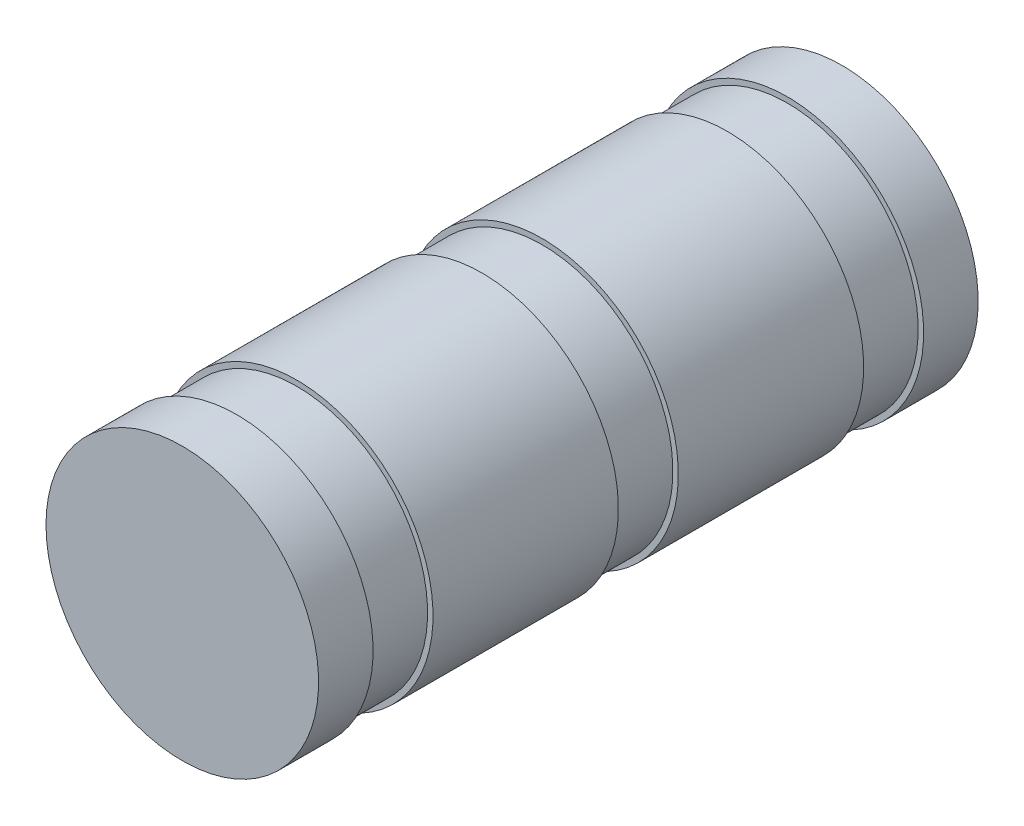
ISO-10303-21;
HEADER;
FILE_DESCRIPTION(('STEP AP214'),'2;1');
FILE_NAME('part.step','',(''),(''),'','','');
FILE_SCHEMA(('AUTOMOTIVE_DESIGN { 1 0 10303 214 1 1 1 1 }'));
ENDSEC;
DATA;
#1=APPLICATION_CONTEXT('core data for automotive mechanical design processes');
#2=APPLICATION_PROTOCOL_DEFINITION('international standard','automotive_design',2000,#1);
#3=PRODUCT_CONTEXT('',#1,'mechanical');
#4=PRODUCT('Part','Part','',(#3));
#5=PRODUCT_RELATED_PRODUCT_CATEGORY('part','',(#4));
#6=PRODUCT_DEFINITION_FORMATION('','',#4);
#7=PRODUCT_DEFINITION_CONTEXT('part definition',#1,'design');
#8=PRODUCT_DEFINITION('design','',#6,#7);
#9=PRODUCT_DEFINITION_SHAPE('','',#8);
#10=(LENGTH_UNIT() NAMED_UNIT(*) SI_UNIT(.MILLI.,.METRE.));
#11=(NAMED_UNIT(*) PLANE_ANGLE_UNIT() SI_UNIT($,.RADIAN.));
#12=(NAMED_UNIT(*) SI_UNIT($,.STERADIAN.) SOLID_ANGLE_UNIT());
#13=UNCERTAINTY_MEASURE_WITH_UNIT(LENGTH_MEASURE(1.E-05),#10,'distance_accuracy_value','');
#14=(GEOMETRIC_REPRESENTATION_CONTEXT(3) GLOBAL_UNCERTAINTY_ASSIGNED_CONTEXT((#13)) GLOBAL_UNIT_ASSIGNED_CONTEXT((#10,
#11,#12)) REPRESENTATION_CONTEXT('',''));
#15=CARTESIAN_POINT('',(0.,0.,0.));
#16=DIRECTION('',(0.,0.,1.));
#17=DIRECTION('',(1.,0.,0.));
#18=AXIS2_PLACEMENT_3D('',#15,#16,#17);
#19=CARTESIAN_POINT('',(0.,0.,0.));
#20=DIRECTION('',(0.,0.,1.));
#21=DIRECTION('',(1.,0.,0.));
#22=AXIS2_PLACEMENT_3D('',#19,#20,#21);
#23=PLANE('',#22);
#24=CARTESIAN_POINT('',(0.,0.,0.));
#25=DIRECTION('',(0.,0.,-1.));
#26=DIRECTION('',(-1.,0.,0.));
#27=AXIS2_PLACEMENT_3D('',#24,#25,#26);
#28=CIRCLE('',#27,2.5);
#29=CARTESIAN_POINT('',(-2.5,0.,0.));
#30=VERTEX_POINT('',#29);
#31=EDGE_CURVE('E12',#30,#30,#28,.T.);
#32=ORIENTED_EDGE('',*,*,#31,.F.);
#33=EDGE_LOOP('',(#32));
#34=FACE_BOUND('',#33,.T.);
#35=ADVANCED_FACE('F44',(#34),#23,.T.);
#36=CARTESIAN_POINT('',(0.,0.,-12.1));
#37=DIRECTION('',(0.,0.,-1.));
#38=DIRECTION('',(-1.,0.,0.));
#39=AXIS2_PLACEMENT_3D('',#36,#37,#38);
#40=CYLINDRICAL_SURFACE('',#39,2.5);
#41=ORIENTED_EDGE('',*,*,#31,.T.);
#42=EDGE_LOOP('',(#41));
#43=FACE_BOUND('',#42,.T.);
#44=CARTESIAN_POINT('',(0.,0.,-0.999999999999999));
#45=DIRECTION('',(0.,0.,-1.));
#46=DIRECTION('',(-1.,0.,0.));
#47=AXIS2_PLACEMENT_3D('',#44,#45,#46);
#48=CIRCLE('',#47,2.5);
#49=CARTESIAN_POINT('',(-2.5,0.,-0.999999999999999));
#50=VERTEX_POINT('',#49);
#51=EDGE_CURVE('E50',#50,#50,#48,.T.);
#52=ORIENTED_EDGE('',*,*,#51,.F.);
#53=EDGE_LOOP('',(#52));
#54=FACE_BOUND('',#53,.T.);
#55=ADVANCED_FACE('F110',(#43,#54),#40,.T.);
#56=CARTESIAN_POINT('',(-2.5,0.,-1.));
#57=DIRECTION('',(0.,0.,-1.));
#58=DIRECTION('',(-1.,0.,0.));
#59=AXIS2_PLACEMENT_3D('',#56,#57,#58);
#60=PLANE('',#59);
#61=ORIENTED_EDGE('',*,*,#51,.T.);
#62=EDGE_LOOP('',(#61));
#63=FACE_BOUND('',#62,.T.);
#64=CARTESIAN_POINT('',(0.,0.,-0.999999999999999));
#65=DIRECTION('',(0.,0.,-1.));
#66=DIRECTION('',(-1.,0.,0.));
#67=AXIS2_PLACEMENT_3D('',#64,#65,#66);
#68=CIRCLE('',#67,2.4);
#69=CARTESIAN_POINT('',(-2.4,0.,-0.999999999999999));
#70=VERTEX_POINT('',#69);
#71=EDGE_CURVE('E54',#70,#70,#68,.T.);
#72=ORIENTED_EDGE('',*,*,#71,.F.);
#73=EDGE_LOOP('',(#72));
#74=FACE_BOUND('',#73,.T.);
#75=ADVANCED_FACE('F115',(#63,#74),#60,.T.);
#76=CARTESIAN_POINT('',(0.,0.,-12.1));
#77=DIRECTION('',(0.,0.,-1.));
#78=DIRECTION('',(-1.,0.,0.));
#79=AXIS2_PLACEMENT_3D('',#76,#77,#78);
#80=CYLINDRICAL_SURFACE('',#79,2.4);
#81=ORIENTED_EDGE('',*,*,#71,.T.);
#82=EDGE_LOOP('',(#81));
#83=FACE_BOUND('',#82,.T.);
#84=CARTESIAN_POINT('',(0.,0.,-2.1));
#85=DIRECTION('',(0.,0.,-1.));
#86=DIRECTION('',(-1.,0.,0.));
#87=AXIS2_PLACEMENT_3D('',#84,#85,#86);
#88=CIRCLE('',#87,2.4);
#89=CARTESIAN_POINT('',(-2.4,0.,-2.1));
#90=VERTEX_POINT('',#89);
#91=EDGE_CURVE('E58',#90,#90,#88,.T.);
#92=ORIENTED_EDGE('',*,*,#91,.F.);
#93=EDGE_LOOP('',(#92));
#94=FACE_BOUND('',#93,.T.);
#95=ADVANCED_FACE('F119',(#83,#94),#80,.T.);
#96=CARTESIAN_POINT('',(-2.4,0.,-2.1));
#97=DIRECTION('',(0.,0.,1.));
#98=DIRECTION('',(1.,0.,0.));
#99=AXIS2_PLACEMENT_3D('',#96,#97,#98);
#100=PLANE('',#99);
#101=ORIENTED_EDGE('',*,*,#91,.T.);
#102=EDGE_LOOP('',(#101));
#103=FACE_BOUND('',#102,.T.);
#104=CARTESIAN_POINT('',(0.,0.,-2.1));
#105=DIRECTION('',(0.,0.,-1.));
#106=DIRECTION('',(-1.,0.,0.));
#107=AXIS2_PLACEMENT_3D('',#104,#105,#106);
#108=CIRCLE('',#107,2.5);
#109=CARTESIAN_POINT('',(-2.5,0.,-2.1));
#110=VERTEX_POINT('',#109);
#111=EDGE_CURVE('E63',#110,#110,#108,.T.);
#112=ORIENTED_EDGE('',*,*,#111,.F.);
#113=EDGE_LOOP('',(#112));
#114=FACE_BOUND('',#113,.T.);
#115=ADVANCED_FACE('F125',(#103,#114),#100,.T.);
#116=CARTESIAN_POINT('',(0.,0.,-12.1));
#117=DIRECTION('',(0.,0.,-1.));
#118=DIRECTION('',(-1.,0.,0.));
#119=AXIS2_PLACEMENT_3D('',#116,#117,#118);
#120=CYLINDRICAL_SURFACE('',#119,2.5);
#121=ORIENTED_EDGE('',*,*,#111,.T.);
#122=EDGE_LOOP('',(#121));
#123=FACE_BOUND('',#122,.T.);
#124=CARTESIAN_POINT('',(0.,0.,-5.5));
#125=DIRECTION('',(0.,0.,-1.));
#126=DIRECTION('',(-1.,0.,0.));
#127=AXIS2_PLACEMENT_3D('',#124,#125,#126);
#128=CIRCLE('',#127,2.5);
#129=CARTESIAN_POINT('',(-2.5,0.,-5.5));
#130=VERTEX_POINT('',#129);
#131=EDGE_CURVE('E66',#130,#130,#128,.T.);
#132=ORIENTED_EDGE('',*,*,#131,.F.);
#133=EDGE_LOOP('',(#132));
#134=FACE_BOUND('',#133,.T.);
#135=ADVANCED_FACE('F129',(#123,#134),#120,.T.);
#136=CARTESIAN_POINT('',(-2.5,0.,-5.5));
#137=DIRECTION('',(0.,0.,-1.));
#138=DIRECTION('',(-1.,0.,0.));
#139=AXIS2_PLACEMENT_3D('',#136,#137,#138);
#140=PLANE('',#139);
#141=ORIENTED_EDGE('',*,*,#131,.T.);
#142=EDGE_LOOP('',(#141));
#143=FACE_BOUND('',#142,.T.);
#144=CARTESIAN_POINT('',(0.,0.,-5.5));
#145=DIRECTION('',(0.,0.,-1.));
#146=DIRECTION('',(-1.,0.,0.));
#147=AXIS2_PLACEMENT_3D('',#144,#145,#146);
#148=CIRCLE('',#147,2.4);
#149=CARTESIAN_POINT('',(-2.4,0.,-5.5));
#150=VERTEX_POINT('',#149);
#151=EDGE_CURVE('E69',#150,#150,#148,.T.);
#152=ORIENTED_EDGE('',*,*,#151,.F.);
#153=EDGE_LOOP('',(#152));
#154=FACE_BOUND('',#153,.T.);
#155=ADVANCED_FACE('F133',(#143,#154),#140,.T.);
#156=CARTESIAN_POINT('',(0.,0.,-12.1));
#157=DIRECTION('',(0.,0.,-1.));
#158=DIRECTION('',(-1.,0.,0.));
#159=AXIS2_PLACEMENT_3D('',#156,#157,#158);
#160=CYLINDRICAL_SURFACE('',#159,2.4);
#161=ORIENTED_EDGE('',*,*,#151,.T.);
#162=EDGE_LOOP('',(#161));
#163=FACE_BOUND('',#162,.T.);
#164=CARTESIAN_POINT('',(0.,0.,-6.6));
#165=DIRECTION('',(0.,0.,-1.));
#166=DIRECTION('',(-1.,0.,0.));
#167=AXIS2_PLACEMENT_3D('',#164,#165,#166);
#168=CIRCLE('',#167,2.4);
#169=CARTESIAN_POINT('',(-2.4,0.,-6.6));
#170=VERTEX_POINT('',#169);
#171=EDGE_CURVE('E72',#170,#170,#168,.T.);
#172=ORIENTED_EDGE('',*,*,#171,.F.);
#173=EDGE_LOOP('',(#172));
#174=FACE_BOUND('',#173,.T.);
#175=ADVANCED_FACE('F137',(#163,#174),#160,.T.);
#176=CARTESIAN_POINT('',(-2.4,0.,-6.6));
#177=DIRECTION('',(0.,0.,1.));
#178=DIRECTION('',(1.,0.,0.));
#179=AXIS2_PLACEMENT_3D('',#176,#177,#178);
#180=PLANE('',#179);
#181=ORIENTED_EDGE('',*,*,#171,.T.);
#182=EDGE_LOOP('',(#181));
#183=FACE_BOUND('',#182,.T.);
#184=CARTESIAN_POINT('',(0.,0.,-6.6));
#185=DIRECTION('',(0.,0.,-1.));
#186=DIRECTION('',(-1.,0.,0.));
#187=AXIS2_PLACEMENT_3D('',#184,#185,#186);
#188=CIRCLE('',#187,2.5);
#189=CARTESIAN_POINT('',(-2.5,0.,-6.6));
#190=VERTEX_POINT('',#189);
#191=EDGE_CURVE('E75',#190,#190,#188,.T.);
#192=ORIENTED_EDGE('',*,*,#191,.F.);
#193=EDGE_LOOP('',(#192));
#194=FACE_BOUND('',#193,.T.);
#195=ADVANCED_FACE('F141',(#183,#194),#180,.T.);
#196=CARTESIAN_POINT('',(0.,0.,-12.1));
#197=DIRECTION('',(0.,0.,-1.));
#198=DIRECTION('',(-1.,0.,0.));
#199=AXIS2_PLACEMENT_3D('',#196,#197,#198);
#200=CYLINDRICAL_SURFACE('',#199,2.5);
#201=ORIENTED_EDGE('',*,*,#191,.T.);
#202=EDGE_LOOP('',(#201));
#203=FACE_BOUND('',#202,.T.);
#204=CARTESIAN_POINT('',(0.,0.,-10.));
#205=DIRECTION('',(0.,0.,-1.));
#206=DIRECTION('',(-1.,0.,0.));
#207=AXIS2_PLACEMENT_3D('',#204,#205,#206);
#208=CIRCLE('',#207,2.5);
#209=CARTESIAN_POINT('',(-2.5,0.,-10.));
#210=VERTEX_POINT('',#209);
#211=EDGE_CURVE('E78',#210,#210,#208,.T.);
#212=ORIENTED_EDGE('',*,*,#211,.F.);
#213=EDGE_LOOP('',(#212));
#214=FACE_BOUND('',#213,.T.);
#215=ADVANCED_FACE('F145',(#203,#214),#200,.T.);
#216=CARTESIAN_POINT('',(-2.5,0.,-10.));
#217=DIRECTION('',(0.,0.,-1.));
#218=DIRECTION('',(-1.,0.,0.));
#219=AXIS2_PLACEMENT_3D('',#216,#217,#218);
#220=PLANE('',#219);
#221=ORIENTED_EDGE('',*,*,#211,.T.);
#222=EDGE_LOOP('',(#221));
#223=FACE_BOUND('',#222,.T.);
#224=CARTESIAN_POINT('',(0.,0.,-10.));
#225=DIRECTION('',(0.,0.,-1.));
#226=DIRECTION('',(-1.,0.,0.));
#227=AXIS2_PLACEMENT_3D('',#224,#225,#226);
#228=CIRCLE('',#227,2.4);
#229=CARTESIAN_POINT('',(-2.4,0.,-10.));
#230=VERTEX_POINT('',#229);
#231=EDGE_CURVE('E81',#230,#230,#228,.T.);
#232=ORIENTED_EDGE('',*,*,#231,.F.);
#233=EDGE_LOOP('',(#232));
#234=FACE_BOUND('',#233,.T.);
#235=ADVANCED_FACE('F149',(#223,#234),#220,.T.);
#236=CARTESIAN_POINT('',(0.,0.,-12.1));
#237=DIRECTION('',(0.,0.,-1.));
#238=DIRECTION('',(-1.,0.,0.));
#239=AXIS2_PLACEMENT_3D('',#236,#237,#238);
#240=CYLINDRICAL_SURFACE('',#239,2.4);
#241=ORIENTED_EDGE('',*,*,#231,.T.);
#242=EDGE_LOOP('',(#241));
#243=FACE_BOUND('',#242,.T.);
#244=CARTESIAN_POINT('',(0.,0.,-11.1));
#245=DIRECTION('',(0.,0.,-1.));
#246=DIRECTION('',(-1.,0.,0.));
#247=AXIS2_PLACEMENT_3D('',#244,#245,#246);
#248=CIRCLE('',#247,2.4);
#249=CARTESIAN_POINT('',(-2.4,0.,-11.1));
#250=VERTEX_POINT('',#249);
#251=EDGE_CURVE('E84',#250,#250,#248,.T.);
#252=ORIENTED_EDGE('',*,*,#251,.F.);
#253=EDGE_LOOP('',(#252));
#254=FACE_BOUND('',#253,.T.);
#255=ADVANCED_FACE('F106',(#243,#254),#240,.T.);
#256=CARTESIAN_POINT('',(-2.4,0.,-11.1));
#257=DIRECTION('',(0.,0.,1.));
#258=DIRECTION('',(1.,0.,0.));
#259=AXIS2_PLACEMENT_3D('',#256,#257,#258);
#260=PLANE('',#259);
#261=ORIENTED_EDGE('',*,*,#251,.T.);
#262=EDGE_LOOP('',(#261));
#263=FACE_BOUND('',#262,.T.);
#264=CARTESIAN_POINT('',(0.,0.,-11.1));
#265=DIRECTION('',(0.,0.,-1.));
#266=DIRECTION('',(-1.,0.,0.));
#267=AXIS2_PLACEMENT_3D('',#264,#265,#266);
#268=CIRCLE('',#267,2.5);
#269=CARTESIAN_POINT('',(-2.5,0.,-11.1));
#270=VERTEX_POINT('',#269);
#271=EDGE_CURVE('E87',#270,#270,#268,.T.);
#272=ORIENTED_EDGE('',*,*,#271,.F.);
#273=EDGE_LOOP('',(#272));
#274=FACE_BOUND('',#273,.T.);
#275=ADVANCED_FACE('F98',(#263,#274),#260,.T.);
#276=CARTESIAN_POINT('',(0.,0.,-12.1));
#277=DIRECTION('',(0.,0.,-1.));
#278=DIRECTION('',(-1.,0.,0.));
#279=AXIS2_PLACEMENT_3D('',#276,#277,#278);
#280=CYLINDRICAL_SURFACE('',#279,2.5);
#281=ORIENTED_EDGE('',*,*,#271,.T.);
#282=EDGE_LOOP('',(#281));
#283=FACE_BOUND('',#282,.T.);
#284=CARTESIAN_POINT('',(0.,0.,-12.1));
#285=DIRECTION('',(0.,0.,-1.));
#286=DIRECTION('',(-1.,0.,0.));
#287=AXIS2_PLACEMENT_3D('',#284,#285,#286);
#288=CIRCLE('',#287,2.5);
#289=CARTESIAN_POINT('',(-2.5,0.,-12.1));
#290=VERTEX_POINT('',#289);
#291=EDGE_CURVE('E90',#290,#290,#288,.T.);
#292=ORIENTED_EDGE('',*,*,#291,.F.);
#293=EDGE_LOOP('',(#292));
#294=FACE_BOUND('',#293,.T.);
#295=ADVANCED_FACE('F96',(#283,#294),#280,.T.);
#296=CARTESIAN_POINT('',(-2.5,0.,-12.1));
#297=DIRECTION('',(0.,0.,-1.));
#298=DIRECTION('',(-1.,0.,0.));
#299=AXIS2_PLACEMENT_3D('',#296,#297,#298);
#300=PLANE('',#299);
#301=ORIENTED_EDGE('',*,*,#291,.T.);
#302=EDGE_LOOP('',(#301));
#303=FACE_BOUND('',#302,.T.);
#304=ADVANCED_FACE('F94',(#303),#300,.T.);
#305=CLOSED_SHELL('',(#35,#55,#75,#95,#115,#135,#155,#175,#195,#215,#235,#255,#275,#295,#304));
#306=MANIFOLD_SOLID_BREP('B2',#305);
#307=ADVANCED_BREP_SHAPE_REPRESENTATION('',(#18,#306),#14);
#308=SHAPE_DEFINITION_REPRESENTATION(#9,#307);
ENDSEC;
END-ISO-10303-21;
